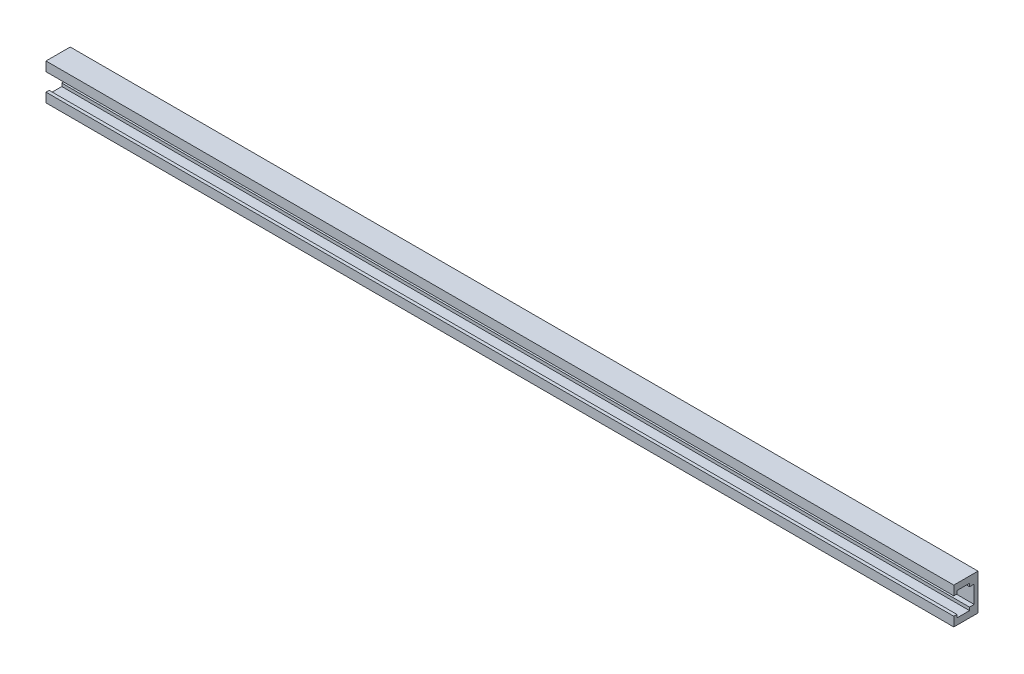
ISO-10303-21;
HEADER;
FILE_DESCRIPTION(('STEP AP214'),'2;1');
FILE_NAME('part.step','',(''),(''),'','','');
FILE_SCHEMA(('AUTOMOTIVE_DESIGN { 1 0 10303 214 1 1 1 1 }'));
ENDSEC;
DATA;
#1=APPLICATION_CONTEXT('core data for automotive mechanical design processes');
#2=APPLICATION_PROTOCOL_DEFINITION('international standard','automotive_design',2000,#1);
#3=PRODUCT_CONTEXT('',#1,'mechanical');
#4=PRODUCT('Part','Part','',(#3));
#5=PRODUCT_RELATED_PRODUCT_CATEGORY('part','',(#4));
#6=PRODUCT_DEFINITION_FORMATION('','',#4);
#7=PRODUCT_DEFINITION_CONTEXT('part definition',#1,'design');
#8=PRODUCT_DEFINITION('design','',#6,#7);
#9=PRODUCT_DEFINITION_SHAPE('','',#8);
#10=(LENGTH_UNIT() NAMED_UNIT(*) SI_UNIT(.MILLI.,.METRE.));
#11=(NAMED_UNIT(*) PLANE_ANGLE_UNIT() SI_UNIT($,.RADIAN.));
#12=(NAMED_UNIT(*) SI_UNIT($,.STERADIAN.) SOLID_ANGLE_UNIT());
#13=UNCERTAINTY_MEASURE_WITH_UNIT(LENGTH_MEASURE(1.E-05),#10,'distance_accuracy_value','');
#14=(GEOMETRIC_REPRESENTATION_CONTEXT(3) GLOBAL_UNCERTAINTY_ASSIGNED_CONTEXT((#13)) GLOBAL_UNIT_ASSIGNED_CONTEXT((#10,
#11,#12)) REPRESENTATION_CONTEXT('',''));
#15=CARTESIAN_POINT('',(0.,0.,0.));
#16=DIRECTION('',(0.,0.,1.));
#17=DIRECTION('',(1.,0.,0.));
#18=AXIS2_PLACEMENT_3D('',#15,#16,#17);
#19=CARTESIAN_POINT('',(228.6,-9.144,0.));
#20=DIRECTION('',(0.,0.,1.));
#21=DIRECTION('',(0.,-1.,0.));
#22=AXIS2_PLACEMENT_3D('',#19,#20,#21);
#23=PLANE('',#22);
#24=CARTESIAN_POINT('',(190.5,0.,0.));
#25=DIRECTION('',(0.,0.,1.));
#26=DIRECTION('',(0.,-1.,0.));
#27=AXIS2_PLACEMENT_3D('',#24,#25,#26);
#28=CIRCLE('',#27,2.413);
#29=CARTESIAN_POINT('',(190.5,-2.413,0.));
#30=VERTEX_POINT('',#29);
#31=EDGE_CURVE('E211',#30,#30,#28,.F.);
#32=ORIENTED_EDGE('',*,*,#31,.F.);
#33=EDGE_LOOP('',(#32));
#34=FACE_BOUND('',#33,.T.);
#35=CARTESIAN_POINT('',(114.3,0.,0.));
#36=DIRECTION('',(0.,0.,1.));
#37=DIRECTION('',(0.,-1.,0.));
#38=AXIS2_PLACEMENT_3D('',#35,#36,#37);
#39=CIRCLE('',#38,2.413);
#40=CARTESIAN_POINT('',(114.3,-2.413,0.));
#41=VERTEX_POINT('',#40);
#42=EDGE_CURVE('E217',#41,#41,#39,.F.);
#43=ORIENTED_EDGE('',*,*,#42,.F.);
#44=EDGE_LOOP('',(#43));
#45=FACE_BOUND('',#44,.T.);
#46=CARTESIAN_POINT('',(38.1,0.,0.));
#47=DIRECTION('',(0.,0.,1.));
#48=DIRECTION('',(0.,-1.,0.));
#49=AXIS2_PLACEMENT_3D('',#46,#47,#48);
#50=CIRCLE('',#49,2.413);
#51=CARTESIAN_POINT('',(38.1,-2.413,0.));
#52=VERTEX_POINT('',#51);
#53=EDGE_CURVE('E226',#52,#52,#50,.F.);
#54=ORIENTED_EDGE('',*,*,#53,.F.);
#55=EDGE_LOOP('',(#54));
#56=FACE_BOUND('',#55,.T.);
#57=DIRECTION('',(-1.,0.,0.));
#58=VECTOR('',#57,1.);
#59=CARTESIAN_POINT('',(228.6,-9.144,0.));
#60=LINE('',#59,#58);
#61=CARTESIAN_POINT('',(228.6,-9.144,0.));
#62=VERTEX_POINT('',#61);
#63=CARTESIAN_POINT('',(-228.6,-9.144,0.));
#64=VERTEX_POINT('',#63);
#65=EDGE_CURVE('E163',#62,#64,#60,.T.);
#66=ORIENTED_EDGE('',*,*,#65,.T.);
#67=DIRECTION('',(0.,1.,0.));
#68=VECTOR('',#67,1.);
#69=CARTESIAN_POINT('',(-228.6,-9.144,0.));
#70=LINE('',#69,#68);
#71=CARTESIAN_POINT('',(-228.6,9.144,0.));
#72=VERTEX_POINT('',#71);
#73=EDGE_CURVE('E157',#64,#72,#70,.T.);
#74=ORIENTED_EDGE('',*,*,#73,.T.);
#75=DIRECTION('',(-1.,0.,0.));
#76=VECTOR('',#75,1.);
#77=CARTESIAN_POINT('',(228.6,9.144,0.));
#78=LINE('',#77,#76);
#79=CARTESIAN_POINT('',(228.6,9.144,0.));
#80=VERTEX_POINT('',#79);
#81=EDGE_CURVE('E12',#80,#72,#78,.T.);
#82=ORIENTED_EDGE('',*,*,#81,.F.);
#83=DIRECTION('',(0.,1.,0.));
#84=VECTOR('',#83,1.);
#85=CARTESIAN_POINT('',(228.6,-9.144,0.));
#86=LINE('',#85,#84);
#87=EDGE_CURVE('E229',#62,#80,#86,.T.);
#88=ORIENTED_EDGE('',*,*,#87,.F.);
#89=EDGE_LOOP('',(#66,#74,#82,#88));
#90=FACE_BOUND('',#89,.T.);
#91=CARTESIAN_POINT('',(-190.5,0.,0.));
#92=DIRECTION('',(0.,0.,-1.));
#93=DIRECTION('',(0.,-1.,0.));
#94=AXIS2_PLACEMENT_3D('',#91,#92,#93);
#95=CIRCLE('',#94,2.413);
#96=CARTESIAN_POINT('',(-190.5,-2.413,0.));
#97=VERTEX_POINT('',#96);
#98=EDGE_CURVE('E617',#97,#97,#95,.F.);
#99=ORIENTED_EDGE('',*,*,#98,.T.);
#100=EDGE_LOOP('',(#99));
#101=FACE_BOUND('',#100,.T.);
#102=CARTESIAN_POINT('',(-114.3,0.,0.));
#103=DIRECTION('',(0.,0.,-1.));
#104=DIRECTION('',(0.,-1.,0.));
#105=AXIS2_PLACEMENT_3D('',#102,#103,#104);
#106=CIRCLE('',#105,2.413);
#107=CARTESIAN_POINT('',(-114.3,-2.413,0.));
#108=VERTEX_POINT('',#107);
#109=EDGE_CURVE('E621',#108,#108,#106,.F.);
#110=ORIENTED_EDGE('',*,*,#109,.T.);
#111=EDGE_LOOP('',(#110));
#112=FACE_BOUND('',#111,.T.);
#113=CARTESIAN_POINT('',(-38.1,0.,0.));
#114=DIRECTION('',(0.,0.,-1.));
#115=DIRECTION('',(0.,-1.,0.));
#116=AXIS2_PLACEMENT_3D('',#113,#114,#115);
#117=CIRCLE('',#116,2.413);
#118=CARTESIAN_POINT('',(-38.1,-2.413,0.));
#119=VERTEX_POINT('',#118);
#120=EDGE_CURVE('E165',#119,#119,#117,.F.);
#121=ORIENTED_EDGE('',*,*,#120,.T.);
#122=EDGE_LOOP('',(#121));
#123=FACE_BOUND('',#122,.T.);
#124=ADVANCED_FACE('F33',(#34,#45,#56,#90,#101,#112,#123),#23,.F.);
#125=CARTESIAN_POINT('',(228.6,9.144,0.));
#126=DIRECTION('',(0.,-1.,0.));
#127=DIRECTION('',(0.,0.,-1.));
#128=AXIS2_PLACEMENT_3D('',#125,#126,#127);
#129=PLANE('',#128);
#130=ORIENTED_EDGE('',*,*,#81,.T.);
#131=DIRECTION('',(0.,0.,1.));
#132=VECTOR('',#131,1.);
#133=CARTESIAN_POINT('',(-228.6,9.144,0.));
#134=LINE('',#133,#132);
#135=CARTESIAN_POINT('',(-228.6,9.144,12.192));
#136=VERTEX_POINT('',#135);
#137=EDGE_CURVE('E147',#72,#136,#134,.T.);
#138=ORIENTED_EDGE('',*,*,#137,.T.);
#139=DIRECTION('',(-1.,0.,0.));
#140=VECTOR('',#139,1.);
#141=CARTESIAN_POINT('',(228.6,9.144,12.192));
#142=LINE('',#141,#140);
#143=CARTESIAN_POINT('',(228.6,9.144,12.192));
#144=VERTEX_POINT('',#143);
#145=EDGE_CURVE('E40',#144,#136,#142,.T.);
#146=ORIENTED_EDGE('',*,*,#145,.F.);
#147=DIRECTION('',(0.,0.,1.));
#148=VECTOR('',#147,1.);
#149=CARTESIAN_POINT('',(228.6,9.144,0.));
#150=LINE('',#149,#148);
#151=EDGE_CURVE('E148',#80,#144,#150,.T.);
#152=ORIENTED_EDGE('',*,*,#151,.F.);
#153=EDGE_LOOP('',(#130,#138,#146,#152));
#154=FACE_BOUND('',#153,.T.);
#155=ADVANCED_FACE('F145',(#154),#129,.F.);
#156=CARTESIAN_POINT('',(228.6,9.144,12.192));
#157=DIRECTION('',(0.,0.,-1.));
#158=DIRECTION('',(0.,1.,0.));
#159=AXIS2_PLACEMENT_3D('',#156,#157,#158);
#160=PLANE('',#159);
#161=ORIENTED_EDGE('',*,*,#145,.T.);
#162=DIRECTION('',(0.,-1.,0.));
#163=VECTOR('',#162,1.);
#164=CARTESIAN_POINT('',(-228.6,9.144,12.192));
#165=LINE('',#164,#163);
#166=CARTESIAN_POINT('',(-228.6,4.445,12.192));
#167=VERTEX_POINT('',#166);
#168=EDGE_CURVE('E160',#136,#167,#165,.T.);
#169=ORIENTED_EDGE('',*,*,#168,.T.);
#170=DIRECTION('',(-1.,0.,0.));
#171=VECTOR('',#170,1.);
#172=CARTESIAN_POINT('',(228.6,4.445,12.192));
#173=LINE('',#172,#171);
#174=CARTESIAN_POINT('',(228.6,4.445,12.192));
#175=VERTEX_POINT('',#174);
#176=EDGE_CURVE('E283',#175,#167,#173,.T.);
#177=ORIENTED_EDGE('',*,*,#176,.F.);
#178=DIRECTION('',(0.,-1.,0.));
#179=VECTOR('',#178,1.);
#180=CARTESIAN_POINT('',(228.6,9.144,12.192));
#181=LINE('',#180,#179);
#182=EDGE_CURVE('E232',#144,#175,#181,.T.);
#183=ORIENTED_EDGE('',*,*,#182,.F.);
#184=EDGE_LOOP('',(#161,#169,#177,#183));
#185=FACE_BOUND('',#184,.T.);
#186=ADVANCED_FACE('F286',(#185),#160,.F.);
#187=CARTESIAN_POINT('',(228.6,4.445,12.192));
#188=DIRECTION('',(0.,1.,0.));
#189=DIRECTION('',(0.,0.,1.));
#190=AXIS2_PLACEMENT_3D('',#187,#188,#189);
#191=PLANE('',#190);
#192=ORIENTED_EDGE('',*,*,#176,.T.);
#193=DIRECTION('',(0.,0.,-1.));
#194=VECTOR('',#193,1.);
#195=CARTESIAN_POINT('',(-228.6,4.445,12.192));
#196=LINE('',#195,#194);
#197=CARTESIAN_POINT('',(-228.6,4.445,10.6045));
#198=VERTEX_POINT('',#197);
#199=EDGE_CURVE('E173',#167,#198,#196,.T.);
#200=ORIENTED_EDGE('',*,*,#199,.T.);
#201=DIRECTION('',(-1.,0.,0.));
#202=VECTOR('',#201,1.);
#203=CARTESIAN_POINT('',(228.6,4.445,10.6045));
#204=LINE('',#203,#202);
#205=CARTESIAN_POINT('',(228.6,4.445,10.6045));
#206=VERTEX_POINT('',#205);
#207=EDGE_CURVE('E281',#206,#198,#204,.T.);
#208=ORIENTED_EDGE('',*,*,#207,.F.);
#209=DIRECTION('',(0.,0.,-1.));
#210=VECTOR('',#209,1.);
#211=CARTESIAN_POINT('',(228.6,4.445,12.192));
#212=LINE('',#211,#210);
#213=EDGE_CURVE('E234',#175,#206,#212,.T.);
#214=ORIENTED_EDGE('',*,*,#213,.F.);
#215=EDGE_LOOP('',(#192,#200,#208,#214));
#216=FACE_BOUND('',#215,.T.);
#217=ADVANCED_FACE('F294',(#216),#191,.F.);
#218=CARTESIAN_POINT('',(228.6,4.445,10.6045));
#219=DIRECTION('',(0.,0.,1.));
#220=DIRECTION('',(1.,0.,0.));
#221=AXIS2_PLACEMENT_3D('',#218,#219,#220);
#222=PLANE('',#221);
#223=ORIENTED_EDGE('',*,*,#207,.T.);
#224=DIRECTION('',(0.,1.,0.));
#225=VECTOR('',#224,1.);
#226=CARTESIAN_POINT('',(-228.6,4.445,10.6045));
#227=LINE('',#226,#225);
#228=CARTESIAN_POINT('',(-228.6,5.969,10.6045));
#229=VERTEX_POINT('',#228);
#230=EDGE_CURVE('E176',#198,#229,#227,.T.);
#231=ORIENTED_EDGE('',*,*,#230,.T.);
#232=DIRECTION('',(-1.,0.,0.));
#233=VECTOR('',#232,1.);
#234=CARTESIAN_POINT('',(228.6,5.969,10.6045));
#235=LINE('',#234,#233);
#236=CARTESIAN_POINT('',(228.6,5.969,10.6045));
#237=VERTEX_POINT('',#236);
#238=EDGE_CURVE('E279',#237,#229,#235,.T.);
#239=ORIENTED_EDGE('',*,*,#238,.F.);
#240=DIRECTION('',(0.,1.,0.));
#241=VECTOR('',#240,1.);
#242=CARTESIAN_POINT('',(228.6,4.445,10.6045));
#243=LINE('',#242,#241);
#244=EDGE_CURVE('E236',#206,#237,#243,.T.);
#245=ORIENTED_EDGE('',*,*,#244,.F.);
#246=EDGE_LOOP('',(#223,#231,#239,#245));
#247=FACE_BOUND('',#246,.T.);
#248=ADVANCED_FACE('F297',(#247),#222,.F.);
#249=CARTESIAN_POINT('',(228.6,5.969,10.6045));
#250=DIRECTION('',(0.,1.,0.));
#251=DIRECTION('',(0.,0.,1.));
#252=AXIS2_PLACEMENT_3D('',#249,#250,#251);
#253=PLANE('',#252);
#254=ORIENTED_EDGE('',*,*,#238,.T.);
#255=DIRECTION('',(0.,0.,-1.));
#256=VECTOR('',#255,1.);
#257=CARTESIAN_POINT('',(-228.6,5.969,10.6045));
#258=LINE('',#257,#256);
#259=CARTESIAN_POINT('',(-228.6,5.969,4.2545));
#260=VERTEX_POINT('',#259);
#261=EDGE_CURVE('E179',#229,#260,#258,.T.);
#262=ORIENTED_EDGE('',*,*,#261,.T.);
#263=DIRECTION('',(-1.,0.,0.));
#264=VECTOR('',#263,1.);
#265=CARTESIAN_POINT('',(228.6,5.969,4.2545));
#266=LINE('',#265,#264);
#267=CARTESIAN_POINT('',(228.6,5.969,4.2545));
#268=VERTEX_POINT('',#267);
#269=EDGE_CURVE('E277',#268,#260,#266,.T.);
#270=ORIENTED_EDGE('',*,*,#269,.F.);
#271=DIRECTION('',(0.,0.,-1.));
#272=VECTOR('',#271,1.);
#273=CARTESIAN_POINT('',(228.6,5.969,10.6045));
#274=LINE('',#273,#272);
#275=EDGE_CURVE('E238',#237,#268,#274,.T.);
#276=ORIENTED_EDGE('',*,*,#275,.F.);
#277=EDGE_LOOP('',(#254,#262,#270,#276));
#278=FACE_BOUND('',#277,.T.);
#279=ADVANCED_FACE('F302',(#278),#253,.F.);
#280=CARTESIAN_POINT('',(228.6,5.969,4.2545));
#281=DIRECTION('',(0.,0.,-1.));
#282=DIRECTION('',(-1.,0.,0.));
#283=AXIS2_PLACEMENT_3D('',#280,#281,#282);
#284=PLANE('',#283);
#285=ORIENTED_EDGE('',*,*,#269,.T.);
#286=DIRECTION('',(0.,-1.,0.));
#287=VECTOR('',#286,1.);
#288=CARTESIAN_POINT('',(-228.6,5.969,4.2545));
#289=LINE('',#288,#287);
#290=CARTESIAN_POINT('',(-228.6,4.445,4.2545));
#291=VERTEX_POINT('',#290);
#292=EDGE_CURVE('E182',#260,#291,#289,.T.);
#293=ORIENTED_EDGE('',*,*,#292,.T.);
#294=DIRECTION('',(-1.,0.,0.));
#295=VECTOR('',#294,1.);
#296=CARTESIAN_POINT('',(228.6,4.445,4.2545));
#297=LINE('',#296,#295);
#298=CARTESIAN_POINT('',(228.6,4.445,4.2545));
#299=VERTEX_POINT('',#298);
#300=EDGE_CURVE('E275',#299,#291,#297,.T.);
#301=ORIENTED_EDGE('',*,*,#300,.F.);
#302=DIRECTION('',(0.,-1.,0.));
#303=VECTOR('',#302,1.);
#304=CARTESIAN_POINT('',(228.6,5.969,4.2545));
#305=LINE('',#304,#303);
#306=EDGE_CURVE('E240',#268,#299,#305,.T.);
#307=ORIENTED_EDGE('',*,*,#306,.F.);
#308=EDGE_LOOP('',(#285,#293,#301,#307));
#309=FACE_BOUND('',#308,.T.);
#310=ADVANCED_FACE('F308',(#309),#284,.F.);
#311=CARTESIAN_POINT('',(228.6,4.445,4.2545));
#312=DIRECTION('',(0.,1.,0.));
#313=DIRECTION('',(0.,0.,1.));
#314=AXIS2_PLACEMENT_3D('',#311,#312,#313);
#315=PLANE('',#314);
#316=ORIENTED_EDGE('',*,*,#300,.T.);
#317=DIRECTION('',(0.,0.,-1.));
#318=VECTOR('',#317,1.);
#319=CARTESIAN_POINT('',(-228.6,4.445,4.2545));
#320=LINE('',#319,#318);
#321=CARTESIAN_POINT('',(-228.6,4.445,1.905));
#322=VERTEX_POINT('',#321);
#323=EDGE_CURVE('E185',#291,#322,#320,.T.);
#324=ORIENTED_EDGE('',*,*,#323,.T.);
#325=DIRECTION('',(-1.,0.,0.));
#326=VECTOR('',#325,1.);
#327=CARTESIAN_POINT('',(228.6,4.445,1.905));
#328=LINE('',#327,#326);
#329=CARTESIAN_POINT('',(228.6,4.445,1.905));
#330=VERTEX_POINT('',#329);
#331=EDGE_CURVE('E273',#330,#322,#328,.T.);
#332=ORIENTED_EDGE('',*,*,#331,.F.);
#333=DIRECTION('',(0.,0.,-1.));
#334=VECTOR('',#333,1.);
#335=CARTESIAN_POINT('',(228.6,4.445,4.2545));
#336=LINE('',#335,#334);
#337=EDGE_CURVE('E242',#299,#330,#336,.T.);
#338=ORIENTED_EDGE('',*,*,#337,.F.);
#339=EDGE_LOOP('',(#316,#324,#332,#338));
#340=FACE_BOUND('',#339,.T.);
#341=ADVANCED_FACE('F312',(#340),#315,.F.);
#342=CARTESIAN_POINT('',(228.6,4.445,1.905));
#343=DIRECTION('',(0.,0.,-1.));
#344=DIRECTION('',(0.,1.,0.));
#345=AXIS2_PLACEMENT_3D('',#342,#343,#344);
#346=PLANE('',#345);
#347=CARTESIAN_POINT('',(190.5,0.,1.905));
#348=DIRECTION('',(0.,0.,1.));
#349=DIRECTION('',(1.,0.,0.));
#350=AXIS2_PLACEMENT_3D('',#347,#348,#349);
#351=CIRCLE('',#350,2.413);
#352=CARTESIAN_POINT('',(192.913,0.,1.905));
#353=VERTEX_POINT('',#352);
#354=EDGE_CURVE('E214',#353,#353,#351,.T.);
#355=ORIENTED_EDGE('',*,*,#354,.F.);
#356=EDGE_LOOP('',(#355));
#357=FACE_BOUND('',#356,.T.);
#358=CARTESIAN_POINT('',(114.3,0.,1.905));
#359=DIRECTION('',(0.,0.,1.));
#360=DIRECTION('',(1.,0.,0.));
#361=AXIS2_PLACEMENT_3D('',#358,#359,#360);
#362=CIRCLE('',#361,2.413);
#363=CARTESIAN_POINT('',(116.713,0.,1.905));
#364=VERTEX_POINT('',#363);
#365=EDGE_CURVE('E220',#364,#364,#362,.T.);
#366=ORIENTED_EDGE('',*,*,#365,.F.);
#367=EDGE_LOOP('',(#366));
#368=FACE_BOUND('',#367,.T.);
#369=CARTESIAN_POINT('',(38.1,0.,1.905));
#370=DIRECTION('',(0.,0.,1.));
#371=DIRECTION('',(1.,0.,0.));
#372=AXIS2_PLACEMENT_3D('',#369,#370,#371);
#373=CIRCLE('',#372,2.413);
#374=CARTESIAN_POINT('',(40.513,0.,1.905));
#375=VERTEX_POINT('',#374);
#376=EDGE_CURVE('E223',#375,#375,#373,.T.);
#377=ORIENTED_EDGE('',*,*,#376,.F.);
#378=EDGE_LOOP('',(#377));
#379=FACE_BOUND('',#378,.T.);
#380=ORIENTED_EDGE('',*,*,#331,.T.);
#381=DIRECTION('',(0.,-1.,0.));
#382=VECTOR('',#381,1.);
#383=CARTESIAN_POINT('',(-228.6,4.445,1.905));
#384=LINE('',#383,#382);
#385=CARTESIAN_POINT('',(-228.6,-4.445,1.905));
#386=VERTEX_POINT('',#385);
#387=EDGE_CURVE('E188',#322,#386,#384,.T.);
#388=ORIENTED_EDGE('',*,*,#387,.T.);
#389=DIRECTION('',(-1.,0.,0.));
#390=VECTOR('',#389,1.);
#391=CARTESIAN_POINT('',(228.6,-4.445,1.905));
#392=LINE('',#391,#390);
#393=CARTESIAN_POINT('',(228.6,-4.445,1.905));
#394=VERTEX_POINT('',#393);
#395=EDGE_CURVE('E271',#394,#386,#392,.T.);
#396=ORIENTED_EDGE('',*,*,#395,.F.);
#397=DIRECTION('',(0.,-1.,0.));
#398=VECTOR('',#397,1.);
#399=CARTESIAN_POINT('',(228.6,4.445,1.905));
#400=LINE('',#399,#398);
#401=EDGE_CURVE('E244',#330,#394,#400,.T.);
#402=ORIENTED_EDGE('',*,*,#401,.F.);
#403=EDGE_LOOP('',(#380,#388,#396,#402));
#404=FACE_BOUND('',#403,.T.);
#405=CARTESIAN_POINT('',(-190.5,0.,1.905));
#406=DIRECTION('',(0.,0.,-1.));
#407=DIRECTION('',(-1.,0.,0.));
#408=AXIS2_PLACEMENT_3D('',#405,#406,#407);
#409=CIRCLE('',#408,2.413);
#410=CARTESIAN_POINT('',(-192.913,0.,1.905));
#411=VERTEX_POINT('',#410);
#412=EDGE_CURVE('E620',#411,#411,#409,.T.);
#413=ORIENTED_EDGE('',*,*,#412,.T.);
#414=EDGE_LOOP('',(#413));
#415=FACE_BOUND('',#414,.T.);
#416=CARTESIAN_POINT('',(-114.3,0.,1.905));
#417=DIRECTION('',(0.,0.,-1.));
#418=DIRECTION('',(-1.,0.,0.));
#419=AXIS2_PLACEMENT_3D('',#416,#417,#418);
#420=CIRCLE('',#419,2.413);
#421=CARTESIAN_POINT('',(-116.713,0.,1.905));
#422=VERTEX_POINT('',#421);
#423=EDGE_CURVE('E624',#422,#422,#420,.T.);
#424=ORIENTED_EDGE('',*,*,#423,.T.);
#425=EDGE_LOOP('',(#424));
#426=FACE_BOUND('',#425,.T.);
#427=CARTESIAN_POINT('',(-38.1,0.,1.905));
#428=DIRECTION('',(0.,0.,-1.));
#429=DIRECTION('',(-1.,0.,0.));
#430=AXIS2_PLACEMENT_3D('',#427,#428,#429);
#431=CIRCLE('',#430,2.413);
#432=CARTESIAN_POINT('',(-40.513,0.,1.905));
#433=VERTEX_POINT('',#432);
#434=EDGE_CURVE('E168',#433,#433,#431,.T.);
#435=ORIENTED_EDGE('',*,*,#434,.T.);
#436=EDGE_LOOP('',(#435));
#437=FACE_BOUND('',#436,.T.);
#438=ADVANCED_FACE('F317',(#357,#368,#379,#404,#415,#426,#437),#346,.F.);
#439=CARTESIAN_POINT('',(228.6,-4.445,1.905));
#440=DIRECTION('',(0.,-1.,0.));
#441=DIRECTION('',(0.,0.,-1.));
#442=AXIS2_PLACEMENT_3D('',#439,#440,#441);
#443=PLANE('',#442);
#444=ORIENTED_EDGE('',*,*,#395,.T.);
#445=DIRECTION('',(0.,0.,1.));
#446=VECTOR('',#445,1.);
#447=CARTESIAN_POINT('',(-228.6,-4.445,1.905));
#448=LINE('',#447,#446);
#449=CARTESIAN_POINT('',(-228.6,-4.445,4.2545));
#450=VERTEX_POINT('',#449);
#451=EDGE_CURVE('E191',#386,#450,#448,.T.);
#452=ORIENTED_EDGE('',*,*,#451,.T.);
#453=DIRECTION('',(-1.,0.,0.));
#454=VECTOR('',#453,1.);
#455=CARTESIAN_POINT('',(228.6,-4.445,4.2545));
#456=LINE('',#455,#454);
#457=CARTESIAN_POINT('',(228.6,-4.445,4.2545));
#458=VERTEX_POINT('',#457);
#459=EDGE_CURVE('E269',#458,#450,#456,.T.);
#460=ORIENTED_EDGE('',*,*,#459,.F.);
#461=DIRECTION('',(0.,0.,1.));
#462=VECTOR('',#461,1.);
#463=CARTESIAN_POINT('',(228.6,-4.445,1.905));
#464=LINE('',#463,#462);
#465=EDGE_CURVE('E246',#394,#458,#464,.T.);
#466=ORIENTED_EDGE('',*,*,#465,.F.);
#467=EDGE_LOOP('',(#444,#452,#460,#466));
#468=FACE_BOUND('',#467,.T.);
#469=ADVANCED_FACE('F324',(#468),#443,.F.);
#470=CARTESIAN_POINT('',(228.6,-4.445,4.2545));
#471=DIRECTION('',(0.,0.,-1.));
#472=DIRECTION('',(0.,1.,0.));
#473=AXIS2_PLACEMENT_3D('',#470,#471,#472);
#474=PLANE('',#473);
#475=ORIENTED_EDGE('',*,*,#459,.T.);
#476=DIRECTION('',(0.,-1.,0.));
#477=VECTOR('',#476,1.);
#478=CARTESIAN_POINT('',(-228.6,-4.445,4.2545));
#479=LINE('',#478,#477);
#480=CARTESIAN_POINT('',(-228.6,-5.969,4.2545));
#481=VERTEX_POINT('',#480);
#482=EDGE_CURVE('E194',#450,#481,#479,.T.);
#483=ORIENTED_EDGE('',*,*,#482,.T.);
#484=DIRECTION('',(-1.,0.,0.));
#485=VECTOR('',#484,1.);
#486=CARTESIAN_POINT('',(228.6,-5.969,4.2545));
#487=LINE('',#486,#485);
#488=CARTESIAN_POINT('',(228.6,-5.969,4.2545));
#489=VERTEX_POINT('',#488);
#490=EDGE_CURVE('E267',#489,#481,#487,.T.);
#491=ORIENTED_EDGE('',*,*,#490,.F.);
#492=DIRECTION('',(0.,-1.,0.));
#493=VECTOR('',#492,1.);
#494=CARTESIAN_POINT('',(228.6,-4.445,4.2545));
#495=LINE('',#494,#493);
#496=EDGE_CURVE('E248',#458,#489,#495,.T.);
#497=ORIENTED_EDGE('',*,*,#496,.F.);
#498=EDGE_LOOP('',(#475,#483,#491,#497));
#499=FACE_BOUND('',#498,.T.);
#500=ADVANCED_FACE('F328',(#499),#474,.F.);
#501=CARTESIAN_POINT('',(228.6,-5.969,4.2545));
#502=DIRECTION('',(0.,-1.,0.));
#503=DIRECTION('',(0.,0.,-1.));
#504=AXIS2_PLACEMENT_3D('',#501,#502,#503);
#505=PLANE('',#504);
#506=ORIENTED_EDGE('',*,*,#490,.T.);
#507=DIRECTION('',(0.,0.,1.));
#508=VECTOR('',#507,1.);
#509=CARTESIAN_POINT('',(-228.6,-5.969,4.2545));
#510=LINE('',#509,#508);
#511=CARTESIAN_POINT('',(-228.6,-5.969,10.6045));
#512=VERTEX_POINT('',#511);
#513=EDGE_CURVE('E197',#481,#512,#510,.T.);
#514=ORIENTED_EDGE('',*,*,#513,.T.);
#515=DIRECTION('',(-1.,0.,0.));
#516=VECTOR('',#515,1.);
#517=CARTESIAN_POINT('',(228.6,-5.969,10.6045));
#518=LINE('',#517,#516);
#519=CARTESIAN_POINT('',(228.6,-5.969,10.6045));
#520=VERTEX_POINT('',#519);
#521=EDGE_CURVE('E265',#520,#512,#518,.T.);
#522=ORIENTED_EDGE('',*,*,#521,.F.);
#523=DIRECTION('',(0.,0.,1.));
#524=VECTOR('',#523,1.);
#525=CARTESIAN_POINT('',(228.6,-5.969,4.2545));
#526=LINE('',#525,#524);
#527=EDGE_CURVE('E250',#489,#520,#526,.T.);
#528=ORIENTED_EDGE('',*,*,#527,.F.);
#529=EDGE_LOOP('',(#506,#514,#522,#528));
#530=FACE_BOUND('',#529,.T.);
#531=ADVANCED_FACE('F333',(#530),#505,.F.);
#532=CARTESIAN_POINT('',(228.6,-5.969,10.6045));
#533=DIRECTION('',(0.,0.,1.));
#534=DIRECTION('',(1.,0.,0.));
#535=AXIS2_PLACEMENT_3D('',#532,#533,#534);
#536=PLANE('',#535);
#537=ORIENTED_EDGE('',*,*,#521,.T.);
#538=DIRECTION('',(0.,1.,0.));
#539=VECTOR('',#538,1.);
#540=CARTESIAN_POINT('',(-228.6,-5.969,10.6045));
#541=LINE('',#540,#539);
#542=CARTESIAN_POINT('',(-228.6,-4.445,10.6045));
#543=VERTEX_POINT('',#542);
#544=EDGE_CURVE('E200',#512,#543,#541,.T.);
#545=ORIENTED_EDGE('',*,*,#544,.T.);
#546=DIRECTION('',(-1.,0.,0.));
#547=VECTOR('',#546,1.);
#548=CARTESIAN_POINT('',(228.6,-4.445,10.6045));
#549=LINE('',#548,#547);
#550=CARTESIAN_POINT('',(228.6,-4.445,10.6045));
#551=VERTEX_POINT('',#550);
#552=EDGE_CURVE('E263',#551,#543,#549,.T.);
#553=ORIENTED_EDGE('',*,*,#552,.F.);
#554=DIRECTION('',(0.,1.,0.));
#555=VECTOR('',#554,1.);
#556=CARTESIAN_POINT('',(228.6,-5.969,10.6045));
#557=LINE('',#556,#555);
#558=EDGE_CURVE('E252',#520,#551,#557,.T.);
#559=ORIENTED_EDGE('',*,*,#558,.F.);
#560=EDGE_LOOP('',(#537,#545,#553,#559));
#561=FACE_BOUND('',#560,.T.);
#562=ADVANCED_FACE('F339',(#561),#536,.F.);
#563=CARTESIAN_POINT('',(228.6,-4.445,10.6045));
#564=DIRECTION('',(0.,-1.,0.));
#565=DIRECTION('',(0.,0.,-1.));
#566=AXIS2_PLACEMENT_3D('',#563,#564,#565);
#567=PLANE('',#566);
#568=ORIENTED_EDGE('',*,*,#552,.T.);
#569=DIRECTION('',(0.,0.,1.));
#570=VECTOR('',#569,1.);
#571=CARTESIAN_POINT('',(-228.6,-4.445,10.6045));
#572=LINE('',#571,#570);
#573=CARTESIAN_POINT('',(-228.6,-4.445,12.192));
#574=VERTEX_POINT('',#573);
#575=EDGE_CURVE('E203',#543,#574,#572,.T.);
#576=ORIENTED_EDGE('',*,*,#575,.T.);
#577=DIRECTION('',(-1.,0.,0.));
#578=VECTOR('',#577,1.);
#579=CARTESIAN_POINT('',(228.6,-4.445,12.192));
#580=LINE('',#579,#578);
#581=CARTESIAN_POINT('',(228.6,-4.445,12.192));
#582=VERTEX_POINT('',#581);
#583=EDGE_CURVE('E261',#582,#574,#580,.T.);
#584=ORIENTED_EDGE('',*,*,#583,.F.);
#585=DIRECTION('',(0.,0.,1.));
#586=VECTOR('',#585,1.);
#587=CARTESIAN_POINT('',(228.6,-4.445,10.6045));
#588=LINE('',#587,#586);
#589=EDGE_CURVE('E254',#551,#582,#588,.T.);
#590=ORIENTED_EDGE('',*,*,#589,.F.);
#591=EDGE_LOOP('',(#568,#576,#584,#590));
#592=FACE_BOUND('',#591,.T.);
#593=ADVANCED_FACE('F343',(#592),#567,.F.);
#594=CARTESIAN_POINT('',(228.6,-4.445,12.192));
#595=DIRECTION('',(0.,0.,-1.));
#596=DIRECTION('',(0.,1.,0.));
#597=AXIS2_PLACEMENT_3D('',#594,#595,#596);
#598=PLANE('',#597);
#599=ORIENTED_EDGE('',*,*,#583,.T.);
#600=DIRECTION('',(0.,-1.,0.));
#601=VECTOR('',#600,1.);
#602=CARTESIAN_POINT('',(-228.6,-4.445,12.192));
#603=LINE('',#602,#601);
#604=CARTESIAN_POINT('',(-228.6,-9.14400000000001,12.192));
#605=VERTEX_POINT('',#604);
#606=EDGE_CURVE('E206',#574,#605,#603,.T.);
#607=ORIENTED_EDGE('',*,*,#606,.T.);
#608=DIRECTION('',(-1.,0.,0.));
#609=VECTOR('',#608,1.);
#610=CARTESIAN_POINT('',(228.6,-9.14400000000001,12.192));
#611=LINE('',#610,#609);
#612=CARTESIAN_POINT('',(228.6,-9.14400000000001,12.192));
#613=VERTEX_POINT('',#612);
#614=EDGE_CURVE('E259',#613,#605,#611,.T.);
#615=ORIENTED_EDGE('',*,*,#614,.F.);
#616=DIRECTION('',(0.,-1.,0.));
#617=VECTOR('',#616,1.);
#618=CARTESIAN_POINT('',(228.6,-4.445,12.192));
#619=LINE('',#618,#617);
#620=EDGE_CURVE('E52',#582,#613,#619,.T.);
#621=ORIENTED_EDGE('',*,*,#620,.F.);
#622=EDGE_LOOP('',(#599,#607,#615,#621));
#623=FACE_BOUND('',#622,.T.);
#624=ADVANCED_FACE('F346',(#623),#598,.F.);
#625=CARTESIAN_POINT('',(228.6,-9.14400000000001,12.192));
#626=DIRECTION('',(0.,1.,0.));
#627=DIRECTION('',(0.,0.,1.));
#628=AXIS2_PLACEMENT_3D('',#625,#626,#627);
#629=PLANE('',#628);
#630=ORIENTED_EDGE('',*,*,#614,.T.);
#631=DIRECTION('',(0.,0.,-1.));
#632=VECTOR('',#631,1.);
#633=CARTESIAN_POINT('',(-228.6,-9.14400000000001,12.192));
#634=LINE('',#633,#632);
#635=EDGE_CURVE('E209',#605,#64,#634,.T.);
#636=ORIENTED_EDGE('',*,*,#635,.T.);
#637=ORIENTED_EDGE('',*,*,#65,.F.);
#638=DIRECTION('',(0.,0.,-1.));
#639=VECTOR('',#638,1.);
#640=CARTESIAN_POINT('',(228.6,-9.14400000000001,12.192));
#641=LINE('',#640,#639);
#642=EDGE_CURVE('E47',#613,#62,#641,.T.);
#643=ORIENTED_EDGE('',*,*,#642,.F.);
#644=EDGE_LOOP('',(#630,#636,#637,#643));
#645=FACE_BOUND('',#644,.T.);
#646=ADVANCED_FACE('F348',(#645),#629,.F.);
#647=CARTESIAN_POINT('',(228.6,9.144,0.));
#648=DIRECTION('',(1.,0.,0.));
#649=DIRECTION('',(0.,0.,-1.));
#650=AXIS2_PLACEMENT_3D('',#647,#648,#649);
#651=PLANE('',#650);
#652=ORIENTED_EDGE('',*,*,#87,.T.);
#653=ORIENTED_EDGE('',*,*,#151,.T.);
#654=ORIENTED_EDGE('',*,*,#182,.T.);
#655=ORIENTED_EDGE('',*,*,#213,.T.);
#656=ORIENTED_EDGE('',*,*,#244,.T.);
#657=ORIENTED_EDGE('',*,*,#275,.T.);
#658=ORIENTED_EDGE('',*,*,#306,.T.);
#659=ORIENTED_EDGE('',*,*,#337,.T.);
#660=ORIENTED_EDGE('',*,*,#401,.T.);
#661=ORIENTED_EDGE('',*,*,#465,.T.);
#662=ORIENTED_EDGE('',*,*,#496,.T.);
#663=ORIENTED_EDGE('',*,*,#527,.T.);
#664=ORIENTED_EDGE('',*,*,#558,.T.);
#665=ORIENTED_EDGE('',*,*,#589,.T.);
#666=ORIENTED_EDGE('',*,*,#620,.T.);
#667=ORIENTED_EDGE('',*,*,#642,.T.);
#668=EDGE_LOOP('',(#652,#653,#654,#655,#656,#657,#658,#659,#660,#661,#662,#663,#664,#665,#666,#667));
#669=FACE_BOUND('',#668,.T.);
#670=ADVANCED_FACE('F289',(#669),#651,.T.);
#671=CARTESIAN_POINT('',(38.1,0.,-6.82499465201257));
#672=DIRECTION('',(0.,0.,1.));
#673=DIRECTION('',(1.,0.,0.));
#674=AXIS2_PLACEMENT_3D('',#671,#672,#673);
#675=CYLINDRICAL_SURFACE('',#674,2.413);
#676=ORIENTED_EDGE('',*,*,#53,.T.);
#677=EDGE_LOOP('',(#676));
#678=FACE_BOUND('',#677,.T.);
#679=ORIENTED_EDGE('',*,*,#376,.T.);
#680=EDGE_LOOP('',(#679));
#681=FACE_BOUND('',#680,.T.);
#682=ADVANCED_FACE('F355',(#678,#681),#675,.F.);
#683=CARTESIAN_POINT('',(114.3,0.,-6.82499465201257));
#684=DIRECTION('',(0.,0.,1.));
#685=DIRECTION('',(1.,0.,0.));
#686=AXIS2_PLACEMENT_3D('',#683,#684,#685);
#687=CYLINDRICAL_SURFACE('',#686,2.413);
#688=ORIENTED_EDGE('',*,*,#42,.T.);
#689=EDGE_LOOP('',(#688));
#690=FACE_BOUND('',#689,.T.);
#691=ORIENTED_EDGE('',*,*,#365,.T.);
#692=EDGE_LOOP('',(#691));
#693=FACE_BOUND('',#692,.T.);
#694=ADVANCED_FACE('F371',(#690,#693),#687,.F.);
#695=CARTESIAN_POINT('',(190.5,0.,-6.82499465201257));
#696=DIRECTION('',(0.,0.,1.));
#697=DIRECTION('',(1.,0.,0.));
#698=AXIS2_PLACEMENT_3D('',#695,#696,#697);
#699=CYLINDRICAL_SURFACE('',#698,2.413);
#700=ORIENTED_EDGE('',*,*,#31,.T.);
#701=EDGE_LOOP('',(#700));
#702=FACE_BOUND('',#701,.T.);
#703=ORIENTED_EDGE('',*,*,#354,.T.);
#704=EDGE_LOOP('',(#703));
#705=FACE_BOUND('',#704,.T.);
#706=ADVANCED_FACE('F491',(#702,#705),#699,.F.);
#707=CARTESIAN_POINT('',(-228.6,9.144,0.));
#708=DIRECTION('',(-1.,0.,0.));
#709=DIRECTION('',(0.,0.,-1.));
#710=AXIS2_PLACEMENT_3D('',#707,#708,#709);
#711=PLANE('',#710);
#712=ORIENTED_EDGE('',*,*,#73,.F.);
#713=ORIENTED_EDGE('',*,*,#635,.F.);
#714=ORIENTED_EDGE('',*,*,#606,.F.);
#715=ORIENTED_EDGE('',*,*,#575,.F.);
#716=ORIENTED_EDGE('',*,*,#544,.F.);
#717=ORIENTED_EDGE('',*,*,#513,.F.);
#718=ORIENTED_EDGE('',*,*,#482,.F.);
#719=ORIENTED_EDGE('',*,*,#451,.F.);
#720=ORIENTED_EDGE('',*,*,#387,.F.);
#721=ORIENTED_EDGE('',*,*,#323,.F.);
#722=ORIENTED_EDGE('',*,*,#292,.F.);
#723=ORIENTED_EDGE('',*,*,#261,.F.);
#724=ORIENTED_EDGE('',*,*,#230,.F.);
#725=ORIENTED_EDGE('',*,*,#199,.F.);
#726=ORIENTED_EDGE('',*,*,#168,.F.);
#727=ORIENTED_EDGE('',*,*,#137,.F.);
#728=EDGE_LOOP('',(#712,#713,#714,#715,#716,#717,#718,#719,#720,#721,#722,#723,#724,#725,#726,#727));
#729=FACE_BOUND('',#728,.T.);
#730=ADVANCED_FACE('F155',(#729),#711,.T.);
#731=CARTESIAN_POINT('',(-38.1,0.,-6.82499465201257));
#732=DIRECTION('',(0.,0.,1.));
#733=DIRECTION('',(-1.,0.,0.));
#734=AXIS2_PLACEMENT_3D('',#731,#732,#733);
#735=CYLINDRICAL_SURFACE('',#734,2.413);
#736=ORIENTED_EDGE('',*,*,#120,.F.);
#737=EDGE_LOOP('',(#736));
#738=FACE_BOUND('',#737,.T.);
#739=ORIENTED_EDGE('',*,*,#434,.F.);
#740=EDGE_LOOP('',(#739));
#741=FACE_BOUND('',#740,.T.);
#742=ADVANCED_FACE('F490',(#738,#741),#735,.F.);
#743=CARTESIAN_POINT('',(-114.3,0.,-6.82499465201257));
#744=DIRECTION('',(0.,0.,1.));
#745=DIRECTION('',(-1.,0.,0.));
#746=AXIS2_PLACEMENT_3D('',#743,#744,#745);
#747=CYLINDRICAL_SURFACE('',#746,2.413);
#748=ORIENTED_EDGE('',*,*,#109,.F.);
#749=EDGE_LOOP('',(#748));
#750=FACE_BOUND('',#749,.T.);
#751=ORIENTED_EDGE('',*,*,#423,.F.);
#752=EDGE_LOOP('',(#751));
#753=FACE_BOUND('',#752,.T.);
#754=ADVANCED_FACE('F501',(#750,#753),#747,.F.);
#755=CARTESIAN_POINT('',(-190.5,0.,-6.82499465201257));
#756=DIRECTION('',(0.,0.,1.));
#757=DIRECTION('',(-1.,0.,0.));
#758=AXIS2_PLACEMENT_3D('',#755,#756,#757);
#759=CYLINDRICAL_SURFACE('',#758,2.413);
#760=ORIENTED_EDGE('',*,*,#98,.F.);
#761=EDGE_LOOP('',(#760));
#762=FACE_BOUND('',#761,.T.);
#763=ORIENTED_EDGE('',*,*,#412,.F.);
#764=EDGE_LOOP('',(#763));
#765=FACE_BOUND('',#764,.T.);
#766=ADVANCED_FACE('F511',(#762,#765),#759,.F.);
#767=CLOSED_SHELL('',(#124,#155,#186,#217,#248,#279,#310,#341,#438,#469,#500,#531,#562,#593,
#624,#646,#670,#682,#694,#706,#730,#742,#754,#766));
#768=MANIFOLD_SOLID_BREP('B2',#767);
#769=ADVANCED_BREP_SHAPE_REPRESENTATION('',(#18,#768),#14);
#770=SHAPE_DEFINITION_REPRESENTATION(#9,#769);
ENDSEC;
END-ISO-10303-21;
